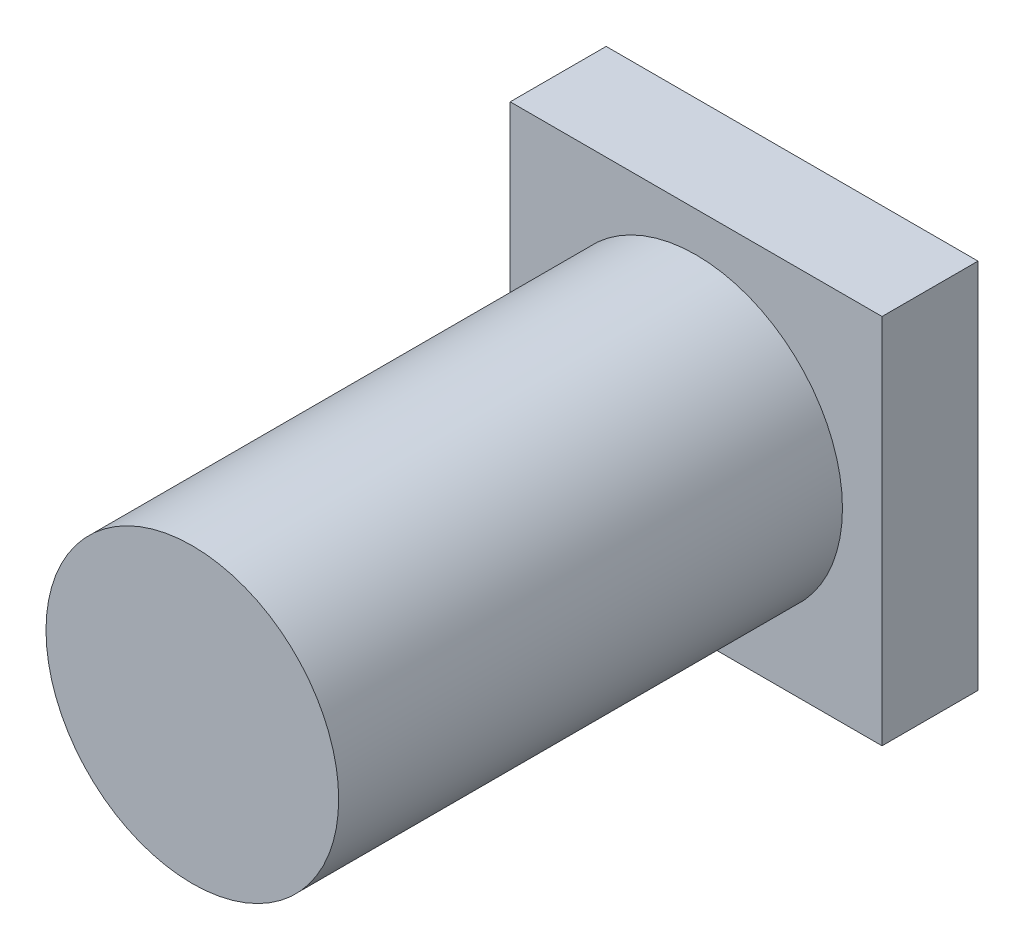
ISO-10303-21;
HEADER;
FILE_DESCRIPTION(('STEP AP214'),'2;1');
FILE_NAME('part.step','',(''),(''),'','','');
FILE_SCHEMA(('AUTOMOTIVE_DESIGN { 1 0 10303 214 1 1 1 1 }'));
ENDSEC;
DATA;
#1=APPLICATION_CONTEXT('core data for automotive mechanical design processes');
#2=APPLICATION_PROTOCOL_DEFINITION('international standard','automotive_design',2000,#1);
#3=PRODUCT_CONTEXT('',#1,'mechanical');
#4=PRODUCT('Part','Part','',(#3));
#5=PRODUCT_RELATED_PRODUCT_CATEGORY('part','',(#4));
#6=PRODUCT_DEFINITION_FORMATION('','',#4);
#7=PRODUCT_DEFINITION_CONTEXT('part definition',#1,'design');
#8=PRODUCT_DEFINITION('design','',#6,#7);
#9=PRODUCT_DEFINITION_SHAPE('','',#8);
#10=(LENGTH_UNIT() NAMED_UNIT(*) SI_UNIT(.MILLI.,.METRE.));
#11=(NAMED_UNIT(*) PLANE_ANGLE_UNIT() SI_UNIT($,.RADIAN.));
#12=(NAMED_UNIT(*) SI_UNIT($,.STERADIAN.) SOLID_ANGLE_UNIT());
#13=UNCERTAINTY_MEASURE_WITH_UNIT(LENGTH_MEASURE(1.E-05),#10,'distance_accuracy_value','');
#14=(GEOMETRIC_REPRESENTATION_CONTEXT(3) GLOBAL_UNCERTAINTY_ASSIGNED_CONTEXT((#13)) GLOBAL_UNIT_ASSIGNED_CONTEXT((#10,
#11,#12)) REPRESENTATION_CONTEXT('',''));
#15=CARTESIAN_POINT('',(0.,0.,0.));
#16=DIRECTION('',(0.,0.,1.));
#17=DIRECTION('',(1.,0.,0.));
#18=AXIS2_PLACEMENT_3D('',#15,#16,#17);
#19=CARTESIAN_POINT('',(0.,0.,10.5));
#20=DIRECTION('',(0.,0.,-1.));
#21=DIRECTION('',(-1.,0.,0.));
#22=AXIS2_PLACEMENT_3D('',#19,#20,#21);
#23=CYLINDRICAL_SURFACE('',#22,6.1);
#24=CARTESIAN_POINT('',(0.,0.,10.5));
#25=DIRECTION('',(0.,0.,1.));
#26=DIRECTION('',(1.,0.,0.));
#27=AXIS2_PLACEMENT_3D('',#24,#25,#26);
#28=CIRCLE('',#27,6.1);
#29=CARTESIAN_POINT('',(-6.1,0.,10.5));
#30=VERTEX_POINT('',#29);
#31=EDGE_CURVE('E12',#30,#30,#28,.T.);
#32=CARTESIAN_POINT('',(0.,0.,-10.5));
#33=DIRECTION('',(0.,0.,1.));
#34=DIRECTION('',(1.,0.,0.));
#35=AXIS2_PLACEMENT_3D('',#32,#33,#34);
#36=CIRCLE('',#35,6.1);
#37=CARTESIAN_POINT('',(-6.1,0.,-10.5));
#38=VERTEX_POINT('',#37);
#39=EDGE_CURVE('E43',#38,#38,#36,.T.);
#40=CARTESIAN_POINT('',(-6.1,0.,10.5));
#41=CARTESIAN_POINT('',(-6.1,0.,10.28125));
#42=CARTESIAN_POINT('',(-6.1,0.,10.0625));
#43=CARTESIAN_POINT('',(-6.1,0.,9.625));
#44=CARTESIAN_POINT('',(-6.1,0.,9.40625));
#45=CARTESIAN_POINT('',(-6.1,0.,8.96875));
#46=CARTESIAN_POINT('',(-6.1,0.,8.75));
#47=CARTESIAN_POINT('',(-6.1,0.,8.3125));
#48=CARTESIAN_POINT('',(-6.1,0.,8.09375));
#49=CARTESIAN_POINT('',(-6.1,0.,7.65625));
#50=CARTESIAN_POINT('',(-6.1,0.,7.4375));
#51=CARTESIAN_POINT('',(-6.1,0.,7.));
#52=CARTESIAN_POINT('',(-6.1,0.,6.78125));
#53=CARTESIAN_POINT('',(-6.1,0.,6.34375));
#54=CARTESIAN_POINT('',(-6.1,0.,6.125));
#55=CARTESIAN_POINT('',(-6.1,0.,5.6875));
#56=CARTESIAN_POINT('',(-6.1,0.,5.46875));
#57=CARTESIAN_POINT('',(-6.1,0.,5.03125));
#58=CARTESIAN_POINT('',(-6.1,0.,4.8125));
#59=CARTESIAN_POINT('',(-6.1,0.,4.375));
#60=CARTESIAN_POINT('',(-6.1,0.,4.15625));
#61=CARTESIAN_POINT('',(-6.1,0.,3.71875));
#62=CARTESIAN_POINT('',(-6.1,0.,3.5));
#63=CARTESIAN_POINT('',(-6.1,0.,3.0625));
#64=CARTESIAN_POINT('',(-6.1,0.,2.84375));
#65=CARTESIAN_POINT('',(-6.1,0.,2.40625));
#66=CARTESIAN_POINT('',(-6.1,0.,2.1875));
#67=CARTESIAN_POINT('',(-6.1,0.,1.75));
#68=CARTESIAN_POINT('',(-6.1,0.,1.53125));
#69=CARTESIAN_POINT('',(-6.1,0.,1.09375));
#70=CARTESIAN_POINT('',(-6.1,0.,0.875000000000001));
#71=CARTESIAN_POINT('',(-6.1,0.,0.4375));
#72=CARTESIAN_POINT('',(-6.1,0.,0.21875));
#73=CARTESIAN_POINT('',(-6.1,0.,-0.21875));
#74=CARTESIAN_POINT('',(-6.1,0.,-0.4375));
#75=CARTESIAN_POINT('',(-6.1,0.,-0.875000000000001));
#76=CARTESIAN_POINT('',(-6.1,0.,-1.09375));
#77=CARTESIAN_POINT('',(-6.1,0.,-1.53125));
#78=CARTESIAN_POINT('',(-6.1,0.,-1.75));
#79=CARTESIAN_POINT('',(-6.1,0.,-2.1875));
#80=CARTESIAN_POINT('',(-6.1,0.,-2.40625));
#81=CARTESIAN_POINT('',(-6.1,0.,-2.84375));
#82=CARTESIAN_POINT('',(-6.1,0.,-3.0625));
#83=CARTESIAN_POINT('',(-6.1,0.,-3.5));
#84=CARTESIAN_POINT('',(-6.1,0.,-3.71875));
#85=CARTESIAN_POINT('',(-6.1,0.,-4.15625));
#86=CARTESIAN_POINT('',(-6.1,0.,-4.375));
#87=CARTESIAN_POINT('',(-6.1,0.,-4.8125));
#88=CARTESIAN_POINT('',(-6.1,0.,-5.03125));
#89=CARTESIAN_POINT('',(-6.1,0.,-5.46875));
#90=CARTESIAN_POINT('',(-6.1,0.,-5.6875));
#91=CARTESIAN_POINT('',(-6.1,0.,-6.125));
#92=CARTESIAN_POINT('',(-6.1,0.,-6.34375));
#93=CARTESIAN_POINT('',(-6.1,0.,-6.78125));
#94=CARTESIAN_POINT('',(-6.1,0.,-7.));
#95=CARTESIAN_POINT('',(-6.1,0.,-7.4375));
#96=CARTESIAN_POINT('',(-6.1,0.,-7.65625));
#97=CARTESIAN_POINT('',(-6.1,0.,-8.09375));
#98=CARTESIAN_POINT('',(-6.1,0.,-8.3125));
#99=CARTESIAN_POINT('',(-6.1,0.,-8.75));
#100=CARTESIAN_POINT('',(-6.1,0.,-8.96875));
#101=CARTESIAN_POINT('',(-6.1,0.,-9.40625));
#102=CARTESIAN_POINT('',(-6.1,0.,-9.625));
#103=CARTESIAN_POINT('',(-6.1,0.,-10.0625));
#104=CARTESIAN_POINT('',(-6.1,0.,-10.28125));
#105=CARTESIAN_POINT('',(-6.1,0.,-10.5));
#106=B_SPLINE_CURVE_WITH_KNOTS('',3,(#40,#41,#42,#43,#44,#45,#46,#47,#48,#49,#50,#51,#52,#53,
#54,#55,#56,#57,#58,#59,#60,#61,#62,#63,#64,#65,#66,#67,#68,#69,#70,#71,#72,#73,#74,#75,#76,#77,
#78,#79,#80,#81,#82,#83,#84,#85,#86,#87,#88,#89,#90,#91,#92,#93,#94,#95,#96,#97,#98,#99,#100,
#101,#102,#103,#104,#105),.UNSPECIFIED.,.F.,.F.,(4,2,2,2,2,2,2,2,2,2,2,2,2,2,2,2,2,2,2,2,2,2,2,
2,2,2,2,2,2,2,2,2,4),(0.,0.656250000000001,1.3125,1.96875,2.625,3.28125,3.9375,4.59375,5.25,
5.90625,6.5625,7.21875,7.875,8.53125,9.1875,9.84375,10.5,11.15625,11.8125,12.46875,13.125,
13.78125,14.4375,15.09375,15.75,16.40625,17.0625,17.71875,18.375,19.03125,19.6875,20.34375,21.),.UNSPECIFIED.);
#107=EDGE_CURVE('BSEAM40',#30,#38,#106,.T.);
#108=ORIENTED_EDGE('',*,*,#31,.F.);
#109=ORIENTED_EDGE('',*,*,#39,.T.);
#110=ORIENTED_EDGE('',*,*,#107,.T.);
#111=ORIENTED_EDGE('',*,*,#107,.F.);
#112=EDGE_LOOP('',(#108,#110,#109,#111));
#113=FACE_BOUND('',#112,.T.);
#114=ADVANCED_FACE('F40',(#113),#23,.T.);
#115=CARTESIAN_POINT('',(0.,0.,10.5));
#116=DIRECTION('',(0.,0.,1.));
#117=DIRECTION('',(1.,0.,0.));
#118=AXIS2_PLACEMENT_3D('',#115,#116,#117);
#119=PLANE('',#118);
#120=ORIENTED_EDGE('',*,*,#31,.T.);
#121=EDGE_LOOP('',(#120));
#122=FACE_BOUND('',#121,.T.);
#123=ADVANCED_FACE('F265',(#122),#119,.T.);
#124=CARTESIAN_POINT('',(-7.75,-7.75,-14.5));
#125=DIRECTION('',(1.,0.,0.));
#126=DIRECTION('',(0.,0.,-1.));
#127=AXIS2_PLACEMENT_3D('',#124,#125,#126);
#128=PLANE('',#127);
#129=DIRECTION('',(0.,1.,0.));
#130=VECTOR('',#129,1.);
#131=CARTESIAN_POINT('',(-7.75,-7.75,-10.5));
#132=LINE('',#131,#130);
#133=CARTESIAN_POINT('',(-7.75,-7.75,-10.5));
#134=VERTEX_POINT('',#133);
#135=CARTESIAN_POINT('',(-7.75,7.75,-10.5));
#136=VERTEX_POINT('',#135);
#137=EDGE_CURVE('E191',#134,#136,#132,.T.);
#138=ORIENTED_EDGE('',*,*,#137,.T.);
#139=DIRECTION('',(0.,0.,1.));
#140=VECTOR('',#139,1.);
#141=CARTESIAN_POINT('',(-7.75,7.75,-14.5));
#142=LINE('',#141,#140);
#143=CARTESIAN_POINT('',(-7.75,7.75,-14.5));
#144=VERTEX_POINT('',#143);
#145=EDGE_CURVE('E234',#144,#136,#142,.T.);
#146=ORIENTED_EDGE('',*,*,#145,.F.);
#147=DIRECTION('',(0.,1.,0.));
#148=VECTOR('',#147,1.);
#149=CARTESIAN_POINT('',(-7.75,-7.75,-14.5));
#150=LINE('',#149,#148);
#151=CARTESIAN_POINT('',(-7.75,-7.75,-14.5));
#152=VERTEX_POINT('',#151);
#153=EDGE_CURVE('E203',#152,#144,#150,.T.);
#154=ORIENTED_EDGE('',*,*,#153,.F.);
#155=DIRECTION('',(0.,0.,1.));
#156=VECTOR('',#155,1.);
#157=CARTESIAN_POINT('',(-7.75,-7.75,-14.5));
#158=LINE('',#157,#156);
#159=EDGE_CURVE('E213',#152,#134,#158,.T.);
#160=ORIENTED_EDGE('',*,*,#159,.T.);
#161=EDGE_LOOP('',(#138,#146,#154,#160));
#162=FACE_BOUND('',#161,.T.);
#163=ADVANCED_FACE('F250',(#162),#128,.F.);
#164=CARTESIAN_POINT('',(7.75,7.75,-14.5));
#165=DIRECTION('',(0.,-1.,0.));
#166=DIRECTION('',(0.,0.,-1.));
#167=AXIS2_PLACEMENT_3D('',#164,#165,#166);
#168=PLANE('',#167);
#169=DIRECTION('',(1.,0.,0.));
#170=VECTOR('',#169,1.);
#171=CARTESIAN_POINT('',(7.75,7.75,-10.5));
#172=LINE('',#171,#170);
#173=CARTESIAN_POINT('',(7.75,7.75,-10.5));
#174=VERTEX_POINT('',#173);
#175=EDGE_CURVE('E217',#136,#174,#172,.T.);
#176=ORIENTED_EDGE('',*,*,#175,.T.);
#177=DIRECTION('',(0.,0.,1.));
#178=VECTOR('',#177,1.);
#179=CARTESIAN_POINT('',(7.75,7.75,-14.5));
#180=LINE('',#179,#178);
#181=CARTESIAN_POINT('',(7.75,7.75,-14.5));
#182=VERTEX_POINT('',#181);
#183=EDGE_CURVE('E230',#182,#174,#180,.T.);
#184=ORIENTED_EDGE('',*,*,#183,.F.);
#185=DIRECTION('',(1.,0.,0.));
#186=VECTOR('',#185,1.);
#187=CARTESIAN_POINT('',(7.75,7.75,-14.5));
#188=LINE('',#187,#186);
#189=EDGE_CURVE('E93',#144,#182,#188,.T.);
#190=ORIENTED_EDGE('',*,*,#189,.F.);
#191=ORIENTED_EDGE('',*,*,#145,.T.);
#192=EDGE_LOOP('',(#176,#184,#190,#191));
#193=FACE_BOUND('',#192,.T.);
#194=ADVANCED_FACE('F257',(#193),#168,.F.);
#195=CARTESIAN_POINT('',(7.75,-7.75,-14.5));
#196=DIRECTION('',(-1.,0.,0.));
#197=DIRECTION('',(0.,0.,1.));
#198=AXIS2_PLACEMENT_3D('',#195,#196,#197);
#199=PLANE('',#198);
#200=DIRECTION('',(0.,-1.,0.));
#201=VECTOR('',#200,1.);
#202=CARTESIAN_POINT('',(7.75,-7.75,-10.5));
#203=LINE('',#202,#201);
#204=CARTESIAN_POINT('',(7.75,-7.75,-10.5));
#205=VERTEX_POINT('',#204);
#206=EDGE_CURVE('E220',#174,#205,#203,.T.);
#207=ORIENTED_EDGE('',*,*,#206,.T.);
#208=DIRECTION('',(0.,0.,1.));
#209=VECTOR('',#208,1.);
#210=CARTESIAN_POINT('',(7.75,-7.75,-14.5));
#211=LINE('',#210,#209);
#212=CARTESIAN_POINT('',(7.75,-7.75,-14.5));
#213=VERTEX_POINT('',#212);
#214=EDGE_CURVE('E227',#213,#205,#211,.T.);
#215=ORIENTED_EDGE('',*,*,#214,.F.);
#216=DIRECTION('',(0.,-1.,0.));
#217=VECTOR('',#216,1.);
#218=CARTESIAN_POINT('',(7.75,-7.75,-14.5));
#219=LINE('',#218,#217);
#220=EDGE_CURVE('E208',#182,#213,#219,.T.);
#221=ORIENTED_EDGE('',*,*,#220,.F.);
#222=ORIENTED_EDGE('',*,*,#183,.T.);
#223=EDGE_LOOP('',(#207,#215,#221,#222));
#224=FACE_BOUND('',#223,.T.);
#225=ADVANCED_FACE('F256',(#224),#199,.F.);
#226=CARTESIAN_POINT('',(7.75,-7.75,-14.5));
#227=DIRECTION('',(0.,1.,0.));
#228=DIRECTION('',(0.,0.,1.));
#229=AXIS2_PLACEMENT_3D('',#226,#227,#228);
#230=PLANE('',#229);
#231=DIRECTION('',(-1.,0.,0.));
#232=VECTOR('',#231,1.);
#233=CARTESIAN_POINT('',(7.75,-7.75,-10.5));
#234=LINE('',#233,#232);
#235=EDGE_CURVE('E85',#205,#134,#234,.T.);
#236=ORIENTED_EDGE('',*,*,#235,.T.);
#237=ORIENTED_EDGE('',*,*,#159,.F.);
#238=DIRECTION('',(-1.,0.,0.));
#239=VECTOR('',#238,1.);
#240=CARTESIAN_POINT('',(7.75,-7.75,-14.5));
#241=LINE('',#240,#239);
#242=EDGE_CURVE('E64',#213,#152,#241,.T.);
#243=ORIENTED_EDGE('',*,*,#242,.F.);
#244=ORIENTED_EDGE('',*,*,#214,.T.);
#245=EDGE_LOOP('',(#236,#237,#243,#244));
#246=FACE_BOUND('',#245,.T.);
#247=ADVANCED_FACE('F252',(#246),#230,.F.);
#248=CARTESIAN_POINT('',(0.,0.,-14.5));
#249=DIRECTION('',(0.,0.,1.));
#250=DIRECTION('',(1.,0.,0.));
#251=AXIS2_PLACEMENT_3D('',#248,#249,#250);
#252=PLANE('',#251);
#253=DIRECTION('',(-1.,0.,0.));
#254=VECTOR('',#253,1.);
#255=CARTESIAN_POINT('',(0.749999999999997,-5.,-14.5));
#256=LINE('',#255,#254);
#257=CARTESIAN_POINT('',(0.749999999999997,-5.,-14.5));
#258=VERTEX_POINT('',#257);
#259=CARTESIAN_POINT('',(-1.25,-5.,-14.5));
#260=VERTEX_POINT('',#259);
#261=EDGE_CURVE('E174',#258,#260,#256,.T.);
#262=ORIENTED_EDGE('',*,*,#261,.F.);
#263=DIRECTION('',(0.,-1.,0.));
#264=VECTOR('',#263,1.);
#265=CARTESIAN_POINT('',(0.749999999999997,5.,-14.5));
#266=LINE('',#265,#264);
#267=CARTESIAN_POINT('',(0.749999999999997,5.,-14.5));
#268=VERTEX_POINT('',#267);
#269=EDGE_CURVE('E55',#268,#258,#266,.T.);
#270=ORIENTED_EDGE('',*,*,#269,.F.);
#271=DIRECTION('',(1.,0.,0.));
#272=VECTOR('',#271,1.);
#273=CARTESIAN_POINT('',(0.749999999999997,5.,-14.5));
#274=LINE('',#273,#272);
#275=CARTESIAN_POINT('',(-1.25,5.,-14.5));
#276=VERTEX_POINT('',#275);
#277=EDGE_CURVE('E151',#276,#268,#274,.T.);
#278=ORIENTED_EDGE('',*,*,#277,.F.);
#279=CARTESIAN_POINT('',(-1.25,1.,-14.5));
#280=DIRECTION('',(0.,0.,-1.));
#281=DIRECTION('',(-1.,0.,0.));
#282=AXIS2_PLACEMENT_3D('',#279,#280,#281);
#283=CIRCLE('',#282,4.);
#284=CARTESIAN_POINT('',(-5.25,1.,-14.5));
#285=VERTEX_POINT('',#284);
#286=EDGE_CURVE('E155',#285,#276,#283,.T.);
#287=ORIENTED_EDGE('',*,*,#286,.F.);
#288=DIRECTION('',(0.,1.,0.));
#289=VECTOR('',#288,1.);
#290=CARTESIAN_POINT('',(-5.25,1.,-14.5));
#291=LINE('',#290,#289);
#292=CARTESIAN_POINT('',(-5.25,-1.,-14.5));
#293=VERTEX_POINT('',#292);
#294=EDGE_CURVE('E181',#293,#285,#291,.T.);
#295=ORIENTED_EDGE('',*,*,#294,.F.);
#296=CARTESIAN_POINT('',(-1.25,-1.,-14.5));
#297=DIRECTION('',(0.,0.,-1.));
#298=DIRECTION('',(-1.,0.,0.));
#299=AXIS2_PLACEMENT_3D('',#296,#297,#298);
#300=CIRCLE('',#299,4.);
#301=EDGE_CURVE('E177',#260,#293,#300,.T.);
#302=ORIENTED_EDGE('',*,*,#301,.F.);
#303=EDGE_LOOP('',(#262,#270,#278,#287,#295,#302));
#304=FACE_BOUND('',#303,.T.);
#305=ORIENTED_EDGE('',*,*,#153,.T.);
#306=ORIENTED_EDGE('',*,*,#189,.T.);
#307=ORIENTED_EDGE('',*,*,#220,.T.);
#308=ORIENTED_EDGE('',*,*,#242,.T.);
#309=EDGE_LOOP('',(#305,#306,#307,#308));
#310=FACE_BOUND('',#309,.T.);
#311=ADVANCED_FACE('F245',(#304,#310),#252,.F.);
#312=CARTESIAN_POINT('',(0.,0.,-10.5));
#313=DIRECTION('',(0.,0.,1.));
#314=DIRECTION('',(1.,0.,0.));
#315=AXIS2_PLACEMENT_3D('',#312,#313,#314);
#316=PLANE('',#315);
#317=ORIENTED_EDGE('',*,*,#39,.F.);
#318=EDGE_LOOP('',(#317));
#319=FACE_BOUND('',#318,.T.);
#320=ORIENTED_EDGE('',*,*,#137,.F.);
#321=ORIENTED_EDGE('',*,*,#235,.F.);
#322=ORIENTED_EDGE('',*,*,#206,.F.);
#323=ORIENTED_EDGE('',*,*,#175,.F.);
#324=EDGE_LOOP('',(#320,#321,#322,#323));
#325=FACE_BOUND('',#324,.T.);
#326=ADVANCED_FACE('F242',(#319,#325),#316,.T.);
#327=CARTESIAN_POINT('',(0.749999999999997,5.,-10.5));
#328=DIRECTION('',(1.,0.,0.));
#329=DIRECTION('',(0.,0.,-1.));
#330=AXIS2_PLACEMENT_3D('',#327,#328,#329);
#331=PLANE('',#330);
#332=CARTESIAN_POINT('',(0.749999999999997,0.,-12.5));
#333=DIRECTION('',(-1.,0.,0.));
#334=DIRECTION('',(0.,-1.,0.));
#335=AXIS2_PLACEMENT_3D('',#332,#333,#334);
#336=CIRCLE('',#335,0.800000000000001);
#337=CARTESIAN_POINT('',(0.749999999999997,-0.800000000000001,-12.5));
#338=VERTEX_POINT('',#337);
#339=EDGE_CURVE('E403',#338,#338,#336,.T.);
#340=ORIENTED_EDGE('',*,*,#339,.F.);
#341=EDGE_LOOP('',(#340));
#342=FACE_BOUND('',#341,.T.);
#343=ORIENTED_EDGE('',*,*,#269,.T.);
#344=DIRECTION('',(0.,0.,-1.));
#345=VECTOR('',#344,1.);
#346=CARTESIAN_POINT('',(0.749999999999997,-5.,-10.5));
#347=LINE('',#346,#345);
#348=CARTESIAN_POINT('',(0.749999999999997,-5.,-10.5));
#349=VERTEX_POINT('',#348);
#350=EDGE_CURVE('E125',#349,#258,#347,.T.);
#351=ORIENTED_EDGE('',*,*,#350,.F.);
#352=DIRECTION('',(0.,-1.,0.));
#353=VECTOR('',#352,1.);
#354=CARTESIAN_POINT('',(0.749999999999997,5.,-10.5));
#355=LINE('',#354,#353);
#356=CARTESIAN_POINT('',(0.749999999999997,5.,-10.5));
#357=VERTEX_POINT('',#356);
#358=EDGE_CURVE('E129',#357,#349,#355,.T.);
#359=ORIENTED_EDGE('',*,*,#358,.F.);
#360=DIRECTION('',(0.,0.,-1.));
#361=VECTOR('',#360,1.);
#362=CARTESIAN_POINT('',(0.749999999999997,5.,-10.5));
#363=LINE('',#362,#361);
#364=EDGE_CURVE('E188',#357,#268,#363,.T.);
#365=ORIENTED_EDGE('',*,*,#364,.T.);
#366=EDGE_LOOP('',(#343,#351,#359,#365));
#367=FACE_BOUND('',#366,.T.);
#368=ADVANCED_FACE('F127',(#342,#367),#331,.F.);
#369=CARTESIAN_POINT('',(0.749999999999997,5.,-10.5));
#370=DIRECTION('',(0.,1.,0.));
#371=DIRECTION('',(-1.,0.,0.));
#372=AXIS2_PLACEMENT_3D('',#369,#370,#371);
#373=PLANE('',#372);
#374=ORIENTED_EDGE('',*,*,#277,.T.);
#375=ORIENTED_EDGE('',*,*,#364,.F.);
#376=DIRECTION('',(1.,0.,0.));
#377=VECTOR('',#376,1.);
#378=CARTESIAN_POINT('',(0.749999999999997,5.,-10.5));
#379=LINE('',#378,#377);
#380=CARTESIAN_POINT('',(-1.25,5.,-10.5));
#381=VERTEX_POINT('',#380);
#382=EDGE_CURVE('E136',#381,#357,#379,.T.);
#383=ORIENTED_EDGE('',*,*,#382,.F.);
#384=DIRECTION('',(0.,0.,-1.));
#385=VECTOR('',#384,1.);
#386=CARTESIAN_POINT('',(-1.25,5.,-10.5));
#387=LINE('',#386,#385);
#388=EDGE_CURVE('E192',#381,#276,#387,.T.);
#389=ORIENTED_EDGE('',*,*,#388,.T.);
#390=EDGE_LOOP('',(#374,#375,#383,#389));
#391=FACE_BOUND('',#390,.T.);
#392=ADVANCED_FACE('F318',(#391),#373,.F.);
#393=CARTESIAN_POINT('',(-1.25,1.,-10.5));
#394=DIRECTION('',(0.,0.,-1.));
#395=DIRECTION('',(-1.,0.,0.));
#396=AXIS2_PLACEMENT_3D('',#393,#394,#395);
#397=CYLINDRICAL_SURFACE('',#396,4.);
#398=ORIENTED_EDGE('',*,*,#286,.T.);
#399=ORIENTED_EDGE('',*,*,#388,.F.);
#400=CARTESIAN_POINT('',(-1.25,1.,-10.5));
#401=DIRECTION('',(0.,0.,-1.));
#402=DIRECTION('',(-1.,0.,0.));
#403=AXIS2_PLACEMENT_3D('',#400,#401,#402);
#404=CIRCLE('',#403,4.);
#405=CARTESIAN_POINT('',(-5.25,1.,-10.5));
#406=VERTEX_POINT('',#405);
#407=EDGE_CURVE('E167',#406,#381,#404,.T.);
#408=ORIENTED_EDGE('',*,*,#407,.F.);
#409=DIRECTION('',(0.,0.,-1.));
#410=VECTOR('',#409,1.);
#411=CARTESIAN_POINT('',(-5.25,1.,-10.5));
#412=LINE('',#411,#410);
#413=EDGE_CURVE('E195',#406,#285,#412,.T.);
#414=ORIENTED_EDGE('',*,*,#413,.T.);
#415=EDGE_LOOP('',(#398,#399,#408,#414));
#416=FACE_BOUND('',#415,.T.);
#417=ADVANCED_FACE('F323',(#416),#397,.F.);
#418=CARTESIAN_POINT('',(-5.25,1.,-10.5));
#419=DIRECTION('',(-1.,0.,0.));
#420=DIRECTION('',(0.,0.,1.));
#421=AXIS2_PLACEMENT_3D('',#418,#419,#420);
#422=PLANE('',#421);
#423=ORIENTED_EDGE('',*,*,#294,.T.);
#424=ORIENTED_EDGE('',*,*,#413,.F.);
#425=DIRECTION('',(0.,1.,0.));
#426=VECTOR('',#425,1.);
#427=CARTESIAN_POINT('',(-5.25,1.,-10.5));
#428=LINE('',#427,#426);
#429=CARTESIAN_POINT('',(-5.25,-1.,-10.5));
#430=VERTEX_POINT('',#429);
#431=EDGE_CURVE('E163',#430,#406,#428,.T.);
#432=ORIENTED_EDGE('',*,*,#431,.F.);
#433=DIRECTION('',(0.,0.,-1.));
#434=VECTOR('',#433,1.);
#435=CARTESIAN_POINT('',(-5.25,-1.,-10.5));
#436=LINE('',#435,#434);
#437=EDGE_CURVE('E198',#430,#293,#436,.T.);
#438=ORIENTED_EDGE('',*,*,#437,.T.);
#439=EDGE_LOOP('',(#423,#424,#432,#438));
#440=FACE_BOUND('',#439,.T.);
#441=ADVANCED_FACE('F333',(#440),#422,.F.);
#442=CARTESIAN_POINT('',(-1.25,-1.,-10.5));
#443=DIRECTION('',(0.,0.,-1.));
#444=DIRECTION('',(-1.,0.,0.));
#445=AXIS2_PLACEMENT_3D('',#442,#443,#444);
#446=CYLINDRICAL_SURFACE('',#445,4.);
#447=ORIENTED_EDGE('',*,*,#301,.T.);
#448=ORIENTED_EDGE('',*,*,#437,.F.);
#449=CARTESIAN_POINT('',(-1.25,-1.,-10.5));
#450=DIRECTION('',(0.,0.,-1.));
#451=DIRECTION('',(-1.,0.,0.));
#452=AXIS2_PLACEMENT_3D('',#449,#450,#451);
#453=CIRCLE('',#452,4.);
#454=CARTESIAN_POINT('',(-1.25,-5.,-10.5));
#455=VERTEX_POINT('',#454);
#456=EDGE_CURVE('E145',#455,#430,#453,.T.);
#457=ORIENTED_EDGE('',*,*,#456,.F.);
#458=DIRECTION('',(0.,0.,-1.));
#459=VECTOR('',#458,1.);
#460=CARTESIAN_POINT('',(-1.25,-5.,-10.5));
#461=LINE('',#460,#459);
#462=EDGE_CURVE('E135',#455,#260,#461,.T.);
#463=ORIENTED_EDGE('',*,*,#462,.T.);
#464=EDGE_LOOP('',(#447,#448,#457,#463));
#465=FACE_BOUND('',#464,.T.);
#466=ADVANCED_FACE('F343',(#465),#446,.F.);
#467=CARTESIAN_POINT('',(0.749999999999997,-5.,-10.5));
#468=DIRECTION('',(0.,-1.,0.));
#469=DIRECTION('',(1.,0.,0.));
#470=AXIS2_PLACEMENT_3D('',#467,#468,#469);
#471=PLANE('',#470);
#472=ORIENTED_EDGE('',*,*,#261,.T.);
#473=ORIENTED_EDGE('',*,*,#462,.F.);
#474=DIRECTION('',(-1.,0.,0.));
#475=VECTOR('',#474,1.);
#476=CARTESIAN_POINT('',(0.749999999999997,-5.,-10.5));
#477=LINE('',#476,#475);
#478=EDGE_CURVE('E139',#349,#455,#477,.T.);
#479=ORIENTED_EDGE('',*,*,#478,.F.);
#480=ORIENTED_EDGE('',*,*,#350,.T.);
#481=EDGE_LOOP('',(#472,#473,#479,#480));
#482=FACE_BOUND('',#481,.T.);
#483=ADVANCED_FACE('F140',(#482),#471,.F.);
#484=CARTESIAN_POINT('',(-1.25,-1.,-10.5));
#485=DIRECTION('',(0.,0.,-1.));
#486=DIRECTION('',(-1.,0.,0.));
#487=AXIS2_PLACEMENT_3D('',#484,#485,#486);
#488=PLANE('',#487);
#489=ORIENTED_EDGE('',*,*,#358,.T.);
#490=ORIENTED_EDGE('',*,*,#478,.T.);
#491=ORIENTED_EDGE('',*,*,#456,.T.);
#492=ORIENTED_EDGE('',*,*,#431,.T.);
#493=ORIENTED_EDGE('',*,*,#407,.T.);
#494=ORIENTED_EDGE('',*,*,#382,.T.);
#495=EDGE_LOOP('',(#489,#490,#491,#492,#493,#494));
#496=FACE_BOUND('',#495,.T.);
#497=ADVANCED_FACE('F147',(#496),#488,.T.);
#498=CARTESIAN_POINT('',(10.012741699797,0.,-12.5));
#499=DIRECTION('',(-1.,0.,0.));
#500=DIRECTION('',(0.,-1.,0.));
#501=AXIS2_PLACEMENT_3D('',#498,#499,#500);
#502=CYLINDRICAL_SURFACE('',#501,0.800000000000001);
#503=CARTESIAN_POINT('',(6.25,0.,-12.5));
#504=DIRECTION('',(-1.,0.,0.));
#505=DIRECTION('',(0.,0.,1.));
#506=AXIS2_PLACEMENT_3D('',#503,#504,#505);
#507=CIRCLE('',#506,0.800000000000001);
#508=CARTESIAN_POINT('',(6.25,0.,-11.7));
#509=VERTEX_POINT('',#508);
#510=EDGE_CURVE('E158',#509,#509,#507,.F.);
#511=ORIENTED_EDGE('',*,*,#510,.T.);
#512=EDGE_LOOP('',(#511));
#513=FACE_BOUND('',#512,.T.);
#514=ORIENTED_EDGE('',*,*,#339,.T.);
#515=EDGE_LOOP('',(#514));
#516=FACE_BOUND('',#515,.T.);
#517=ADVANCED_FACE('F370',(#513,#516),#502,.F.);
#518=CARTESIAN_POINT('',(6.25,-7.75,-14.5));
#519=DIRECTION('',(-1.,0.,0.));
#520=DIRECTION('',(0.,0.,1.));
#521=AXIS2_PLACEMENT_3D('',#518,#519,#520);
#522=PLANE('',#521);
#523=ORIENTED_EDGE('',*,*,#510,.F.);
#524=EDGE_LOOP('',(#523));
#525=FACE_BOUND('',#524,.T.);
#526=ADVANCED_FACE('F386',(#525),#522,.T.);
#527=CLOSED_SHELL('',(#114,#123,#163,#194,#225,#247,#311,#326,#368,#392,#417,#441,#466,#483,
#497,#517,#526));
#528=MANIFOLD_SOLID_BREP('B2',#527);
#529=ADVANCED_BREP_SHAPE_REPRESENTATION('',(#18,#528),#14);
#530=SHAPE_DEFINITION_REPRESENTATION(#9,#529);
ENDSEC;
END-ISO-10303-21;
